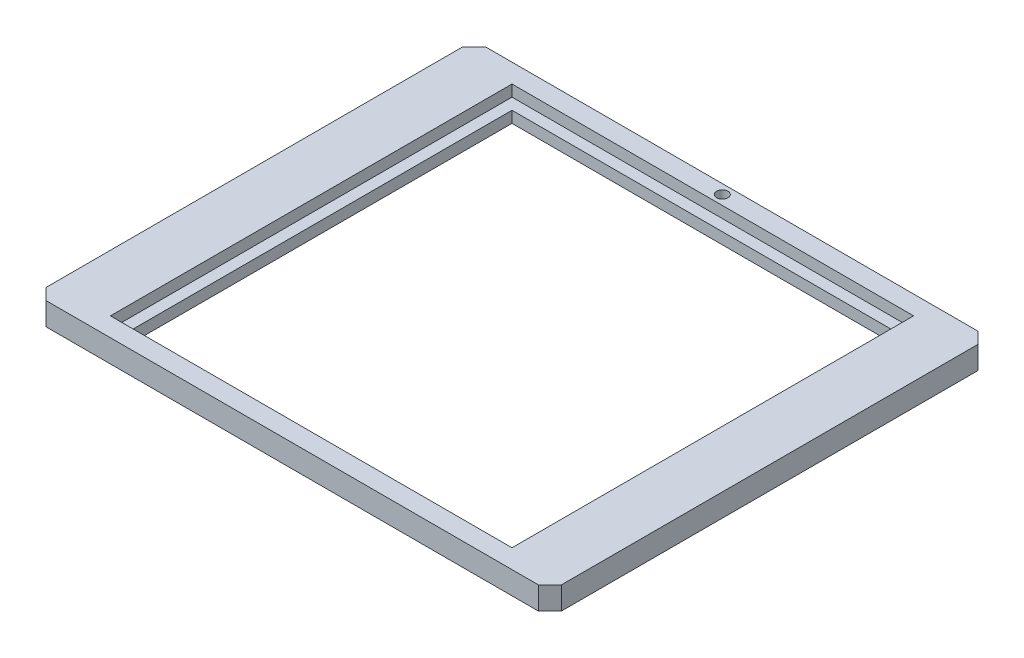
ISO-10303-21;
HEADER;
FILE_DESCRIPTION(('STEP AP214'),'2;1');
FILE_NAME('part.step','',(''),(''),'','','');
FILE_SCHEMA(('AUTOMOTIVE_DESIGN { 1 0 10303 214 1 1 1 1 }'));
ENDSEC;
DATA;
#1=APPLICATION_CONTEXT('core data for automotive mechanical design processes');
#2=APPLICATION_PROTOCOL_DEFINITION('international standard','automotive_design',2000,#1);
#3=PRODUCT_CONTEXT('',#1,'mechanical');
#4=PRODUCT('Part','Part','',(#3));
#5=PRODUCT_RELATED_PRODUCT_CATEGORY('part','',(#4));
#6=PRODUCT_DEFINITION_FORMATION('','',#4);
#7=PRODUCT_DEFINITION_CONTEXT('part definition',#1,'design');
#8=PRODUCT_DEFINITION('design','',#6,#7);
#9=PRODUCT_DEFINITION_SHAPE('','',#8);
#10=(LENGTH_UNIT() NAMED_UNIT(*) SI_UNIT(.MILLI.,.METRE.));
#11=(NAMED_UNIT(*) PLANE_ANGLE_UNIT() SI_UNIT($,.RADIAN.));
#12=(NAMED_UNIT(*) SI_UNIT($,.STERADIAN.) SOLID_ANGLE_UNIT());
#13=UNCERTAINTY_MEASURE_WITH_UNIT(LENGTH_MEASURE(1.E-05),#10,'distance_accuracy_value','');
#14=(GEOMETRIC_REPRESENTATION_CONTEXT(3) GLOBAL_UNCERTAINTY_ASSIGNED_CONTEXT((#13)) GLOBAL_UNIT_ASSIGNED_CONTEXT((#10,
#11,#12)) REPRESENTATION_CONTEXT('',''));
#15=CARTESIAN_POINT('',(0.,0.,0.));
#16=DIRECTION('',(0.,0.,1.));
#17=DIRECTION('',(1.,0.,0.));
#18=AXIS2_PLACEMENT_3D('',#15,#16,#17);
#19=CARTESIAN_POINT('',(68.,6.,58.));
#20=DIRECTION('',(-1.,0.,0.));
#21=DIRECTION('',(0.,0.,1.));
#22=AXIS2_PLACEMENT_3D('',#19,#20,#21);
#23=PLANE('',#22);
#24=DIRECTION('',(0.,0.,-1.));
#25=VECTOR('',#24,1.);
#26=CARTESIAN_POINT('',(68.,0.,58.));
#27=LINE('',#26,#25);
#28=CARTESIAN_POINT('',(68.,0.,55.));
#29=VERTEX_POINT('',#28);
#30=CARTESIAN_POINT('',(68.,0.,-55.));
#31=VERTEX_POINT('',#30);
#32=EDGE_CURVE('E218',#29,#31,#27,.T.);
#33=ORIENTED_EDGE('',*,*,#32,.T.);
#34=DIRECTION('',(0.,1.,0.));
#35=VECTOR('',#34,1.);
#36=CARTESIAN_POINT('',(68.,6.,-55.));
#37=LINE('',#36,#35);
#38=CARTESIAN_POINT('',(68.,6.,-55.));
#39=VERTEX_POINT('',#38);
#40=EDGE_CURVE('E273',#31,#39,#37,.T.);
#41=ORIENTED_EDGE('',*,*,#40,.T.);
#42=DIRECTION('',(0.,0.,-1.));
#43=VECTOR('',#42,1.);
#44=CARTESIAN_POINT('',(68.,6.,58.));
#45=LINE('',#44,#43);
#46=CARTESIAN_POINT('',(68.,6.,55.));
#47=VERTEX_POINT('',#46);
#48=EDGE_CURVE('E225',#47,#39,#45,.T.);
#49=ORIENTED_EDGE('',*,*,#48,.F.);
#50=DIRECTION('',(0.,-1.,0.));
#51=VECTOR('',#50,1.);
#52=CARTESIAN_POINT('',(68.,6.,55.));
#53=LINE('',#52,#51);
#54=EDGE_CURVE('E270',#47,#29,#53,.T.);
#55=ORIENTED_EDGE('',*,*,#54,.T.);
#56=EDGE_LOOP('',(#33,#41,#49,#55));
#57=FACE_BOUND('',#56,.T.);
#58=ADVANCED_FACE('F36',(#57),#23,.F.);
#59=CARTESIAN_POINT('',(-68.,6.,-58.));
#60=DIRECTION('',(0.,0.,1.));
#61=DIRECTION('',(1.,0.,0.));
#62=AXIS2_PLACEMENT_3D('',#59,#60,#61);
#63=PLANE('',#62);
#64=DIRECTION('',(-1.,0.,0.));
#65=VECTOR('',#64,1.);
#66=CARTESIAN_POINT('',(-68.,0.,-58.));
#67=LINE('',#66,#65);
#68=CARTESIAN_POINT('',(65.,0.,-58.));
#69=VERTEX_POINT('',#68);
#70=CARTESIAN_POINT('',(-65.,0.,-58.));
#71=VERTEX_POINT('',#70);
#72=EDGE_CURVE('E239',#69,#71,#67,.T.);
#73=ORIENTED_EDGE('',*,*,#72,.T.);
#74=DIRECTION('',(0.,1.,0.));
#75=VECTOR('',#74,1.);
#76=CARTESIAN_POINT('',(-65.,6.,-58.));
#77=LINE('',#76,#75);
#78=CARTESIAN_POINT('',(-65.,6.,-58.));
#79=VERTEX_POINT('',#78);
#80=EDGE_CURVE('E261',#71,#79,#77,.T.);
#81=ORIENTED_EDGE('',*,*,#80,.T.);
#82=DIRECTION('',(-1.,0.,0.));
#83=VECTOR('',#82,1.);
#84=CARTESIAN_POINT('',(-68.,6.,-58.));
#85=LINE('',#84,#83);
#86=CARTESIAN_POINT('',(65.,6.,-58.));
#87=VERTEX_POINT('',#86);
#88=EDGE_CURVE('E228',#87,#79,#85,.T.);
#89=ORIENTED_EDGE('',*,*,#88,.F.);
#90=DIRECTION('',(0.,-1.,0.));
#91=VECTOR('',#90,1.);
#92=CARTESIAN_POINT('',(65.,6.,-58.));
#93=LINE('',#92,#91);
#94=EDGE_CURVE('E258',#87,#69,#93,.T.);
#95=ORIENTED_EDGE('',*,*,#94,.T.);
#96=EDGE_LOOP('',(#73,#81,#89,#95));
#97=FACE_BOUND('',#96,.T.);
#98=ADVANCED_FACE('F299',(#97),#63,.F.);
#99=CARTESIAN_POINT('',(-68.,6.,58.));
#100=DIRECTION('',(1.,0.,0.));
#101=DIRECTION('',(0.,0.,-1.));
#102=AXIS2_PLACEMENT_3D('',#99,#100,#101);
#103=PLANE('',#102);
#104=DIRECTION('',(0.,0.,1.));
#105=VECTOR('',#104,1.);
#106=CARTESIAN_POINT('',(-68.,6.,58.));
#107=LINE('',#106,#105);
#108=CARTESIAN_POINT('',(-68.,6.,-55.));
#109=VERTEX_POINT('',#108);
#110=CARTESIAN_POINT('',(-68.,6.,55.));
#111=VERTEX_POINT('',#110);
#112=EDGE_CURVE('E232',#109,#111,#107,.T.);
#113=ORIENTED_EDGE('',*,*,#112,.F.);
#114=DIRECTION('',(0.,-1.,0.));
#115=VECTOR('',#114,1.);
#116=CARTESIAN_POINT('',(-68.,6.,-55.));
#117=LINE('',#116,#115);
#118=CARTESIAN_POINT('',(-68.,0.,-55.));
#119=VERTEX_POINT('',#118);
#120=EDGE_CURVE('E247',#109,#119,#117,.T.);
#121=ORIENTED_EDGE('',*,*,#120,.T.);
#122=DIRECTION('',(0.,0.,1.));
#123=VECTOR('',#122,1.);
#124=CARTESIAN_POINT('',(-68.,0.,58.));
#125=LINE('',#124,#123);
#126=CARTESIAN_POINT('',(-68.,0.,55.));
#127=VERTEX_POINT('',#126);
#128=EDGE_CURVE('E242',#119,#127,#125,.T.);
#129=ORIENTED_EDGE('',*,*,#128,.T.);
#130=DIRECTION('',(0.,1.,0.));
#131=VECTOR('',#130,1.);
#132=CARTESIAN_POINT('',(-68.,6.,55.));
#133=LINE('',#132,#131);
#134=EDGE_CURVE('E236',#127,#111,#133,.T.);
#135=ORIENTED_EDGE('',*,*,#134,.T.);
#136=EDGE_LOOP('',(#113,#121,#129,#135));
#137=FACE_BOUND('',#136,.T.);
#138=ADVANCED_FACE('F307',(#137),#103,.F.);
#139=CARTESIAN_POINT('',(-68.,6.,58.));
#140=DIRECTION('',(0.,0.,-1.));
#141=DIRECTION('',(-1.,0.,0.));
#142=AXIS2_PLACEMENT_3D('',#139,#140,#141);
#143=PLANE('',#142);
#144=DIRECTION('',(1.,0.,0.));
#145=VECTOR('',#144,1.);
#146=CARTESIAN_POINT('',(-68.,0.,58.));
#147=LINE('',#146,#145);
#148=CARTESIAN_POINT('',(-65.,0.,58.));
#149=VERTEX_POINT('',#148);
#150=CARTESIAN_POINT('',(65.,0.,58.));
#151=VERTEX_POINT('',#150);
#152=EDGE_CURVE('E229',#149,#151,#147,.T.);
#153=ORIENTED_EDGE('',*,*,#152,.T.);
#154=DIRECTION('',(0.,1.,0.));
#155=VECTOR('',#154,1.);
#156=CARTESIAN_POINT('',(65.,6.,58.));
#157=LINE('',#156,#155);
#158=CARTESIAN_POINT('',(65.,6.,58.));
#159=VERTEX_POINT('',#158);
#160=EDGE_CURVE('E11',#151,#159,#157,.T.);
#161=ORIENTED_EDGE('',*,*,#160,.T.);
#162=DIRECTION('',(1.,0.,0.));
#163=VECTOR('',#162,1.);
#164=CARTESIAN_POINT('',(-68.,6.,58.));
#165=LINE('',#164,#163);
#166=CARTESIAN_POINT('',(-65.,6.,58.));
#167=VERTEX_POINT('',#166);
#168=EDGE_CURVE('E234',#167,#159,#165,.T.);
#169=ORIENTED_EDGE('',*,*,#168,.F.);
#170=DIRECTION('',(0.,-1.,0.));
#171=VECTOR('',#170,1.);
#172=CARTESIAN_POINT('',(-65.,6.,58.));
#173=LINE('',#172,#171);
#174=EDGE_CURVE('E45',#167,#149,#173,.T.);
#175=ORIENTED_EDGE('',*,*,#174,.T.);
#176=EDGE_LOOP('',(#153,#161,#169,#175));
#177=FACE_BOUND('',#176,.T.);
#178=ADVANCED_FACE('F278',(#177),#143,.F.);
#179=CARTESIAN_POINT('',(0.,6.,0.));
#180=DIRECTION('',(0.,-1.,0.));
#181=DIRECTION('',(0.,0.,-1.));
#182=AXIS2_PLACEMENT_3D('',#179,#180,#181);
#183=PLANE('',#182);
#184=CARTESIAN_POINT('',(0.,6.,-55.5));
#185=DIRECTION('',(0.,1.,0.));
#186=DIRECTION('',(0.,0.,1.));
#187=AXIS2_PLACEMENT_3D('',#184,#185,#186);
#188=CIRCLE('',#187,1.5);
#189=CARTESIAN_POINT('',(0.,6.,-54.));
#190=VERTEX_POINT('',#189);
#191=EDGE_CURVE('E488',#190,#190,#188,.T.);
#192=ORIENTED_EDGE('',*,*,#191,.F.);
#193=EDGE_LOOP('',(#192));
#194=FACE_BOUND('',#193,.T.);
#195=DIRECTION('',(-1.,0.,0.));
#196=VECTOR('',#195,1.);
#197=CARTESIAN_POINT('',(-53.,6.,-53.));
#198=LINE('',#197,#196);
#199=CARTESIAN_POINT('',(53.,6.,-53.));
#200=VERTEX_POINT('',#199);
#201=CARTESIAN_POINT('',(-53.,6.,-53.));
#202=VERTEX_POINT('',#201);
#203=EDGE_CURVE('E208',#200,#202,#198,.T.);
#204=ORIENTED_EDGE('',*,*,#203,.F.);
#205=DIRECTION('',(0.,0.,-1.));
#206=VECTOR('',#205,1.);
#207=CARTESIAN_POINT('',(53.,6.,53.));
#208=LINE('',#207,#206);
#209=CARTESIAN_POINT('',(53.,6.,53.));
#210=VERTEX_POINT('',#209);
#211=EDGE_CURVE('E192',#210,#200,#208,.T.);
#212=ORIENTED_EDGE('',*,*,#211,.F.);
#213=DIRECTION('',(1.,0.,0.));
#214=VECTOR('',#213,1.);
#215=CARTESIAN_POINT('',(-53.,6.,53.));
#216=LINE('',#215,#214);
#217=CARTESIAN_POINT('',(-53.,6.,53.));
#218=VERTEX_POINT('',#217);
#219=EDGE_CURVE('E197',#218,#210,#216,.T.);
#220=ORIENTED_EDGE('',*,*,#219,.F.);
#221=DIRECTION('',(0.,0.,1.));
#222=VECTOR('',#221,1.);
#223=CARTESIAN_POINT('',(-53.,6.,53.));
#224=LINE('',#223,#222);
#225=EDGE_CURVE('E211',#202,#218,#224,.T.);
#226=ORIENTED_EDGE('',*,*,#225,.F.);
#227=EDGE_LOOP('',(#204,#212,#220,#226));
#228=FACE_BOUND('',#227,.T.);
#229=ORIENTED_EDGE('',*,*,#88,.T.);
#230=DIRECTION('',(0.707106781186548,0.,-0.707106781186548));
#231=VECTOR('',#230,1.);
#232=CARTESIAN_POINT('',(-68.,6.,-55.));
#233=LINE('',#232,#231);
#234=EDGE_CURVE('E268',#79,#109,#233,.F.);
#235=ORIENTED_EDGE('',*,*,#234,.T.);
#236=ORIENTED_EDGE('',*,*,#112,.T.);
#237=DIRECTION('',(-0.707106781186548,0.,-0.707106781186548));
#238=VECTOR('',#237,1.);
#239=CARTESIAN_POINT('',(-65.,6.,58.));
#240=LINE('',#239,#238);
#241=EDGE_CURVE('E57',#111,#167,#240,.F.);
#242=ORIENTED_EDGE('',*,*,#241,.T.);
#243=ORIENTED_EDGE('',*,*,#168,.T.);
#244=DIRECTION('',(-0.707106781186548,0.,0.707106781186548));
#245=VECTOR('',#244,1.);
#246=CARTESIAN_POINT('',(68.,6.,55.));
#247=LINE('',#246,#245);
#248=EDGE_CURVE('E264',#159,#47,#247,.F.);
#249=ORIENTED_EDGE('',*,*,#248,.T.);
#250=ORIENTED_EDGE('',*,*,#48,.T.);
#251=DIRECTION('',(0.707106781186548,0.,0.707106781186548));
#252=VECTOR('',#251,1.);
#253=CARTESIAN_POINT('',(65.,6.,-58.));
#254=LINE('',#253,#252);
#255=EDGE_CURVE('E266',#39,#87,#254,.F.);
#256=ORIENTED_EDGE('',*,*,#255,.T.);
#257=EDGE_LOOP('',(#229,#235,#236,#242,#243,#249,#250,#256));
#258=FACE_BOUND('',#257,.T.);
#259=ADVANCED_FACE('F292',(#194,#228,#258),#183,.F.);
#260=CARTESIAN_POINT('',(0.,0.,0.));
#261=DIRECTION('',(0.,-1.,0.));
#262=DIRECTION('',(0.,0.,-1.));
#263=AXIS2_PLACEMENT_3D('',#260,#261,#262);
#264=PLANE('',#263);
#265=CARTESIAN_POINT('',(0.,0.,-55.5));
#266=DIRECTION('',(0.,-1.,0.));
#267=DIRECTION('',(0.,0.,-1.));
#268=AXIS2_PLACEMENT_3D('',#265,#266,#267);
#269=CIRCLE('',#268,1.5);
#270=CARTESIAN_POINT('',(0.,0.,-57.));
#271=VERTEX_POINT('',#270);
#272=EDGE_CURVE('E40',#271,#271,#269,.T.);
#273=ORIENTED_EDGE('',*,*,#272,.F.);
#274=EDGE_LOOP('',(#273));
#275=FACE_BOUND('',#274,.T.);
#276=DIRECTION('',(0.,0.,1.));
#277=VECTOR('',#276,1.);
#278=CARTESIAN_POINT('',(50.,0.,0.));
#279=LINE('',#278,#277);
#280=CARTESIAN_POINT('',(50.,0.,-50.));
#281=VERTEX_POINT('',#280);
#282=CARTESIAN_POINT('',(50.,0.,50.));
#283=VERTEX_POINT('',#282);
#284=EDGE_CURVE('E190',#281,#283,#279,.T.);
#285=ORIENTED_EDGE('',*,*,#284,.F.);
#286=DIRECTION('',(1.,0.,0.));
#287=VECTOR('',#286,1.);
#288=CARTESIAN_POINT('',(0.,0.,-50.));
#289=LINE('',#288,#287);
#290=CARTESIAN_POINT('',(-50.,0.,-50.));
#291=VERTEX_POINT('',#290);
#292=EDGE_CURVE('E183',#291,#281,#289,.T.);
#293=ORIENTED_EDGE('',*,*,#292,.F.);
#294=DIRECTION('',(0.,0.,-1.));
#295=VECTOR('',#294,1.);
#296=CARTESIAN_POINT('',(-50.,0.,0.));
#297=LINE('',#296,#295);
#298=CARTESIAN_POINT('',(-50.,0.,50.));
#299=VERTEX_POINT('',#298);
#300=EDGE_CURVE('E158',#299,#291,#297,.T.);
#301=ORIENTED_EDGE('',*,*,#300,.F.);
#302=DIRECTION('',(-1.,0.,0.));
#303=VECTOR('',#302,1.);
#304=CARTESIAN_POINT('',(0.,0.,50.));
#305=LINE('',#304,#303);
#306=EDGE_CURVE('E188',#283,#299,#305,.T.);
#307=ORIENTED_EDGE('',*,*,#306,.F.);
#308=EDGE_LOOP('',(#285,#293,#301,#307));
#309=FACE_BOUND('',#308,.T.);
#310=ORIENTED_EDGE('',*,*,#128,.F.);
#311=DIRECTION('',(-0.707106781186548,0.,0.707106781186548));
#312=VECTOR('',#311,1.);
#313=CARTESIAN_POINT('',(-61.5,0.,-61.5));
#314=LINE('',#313,#312);
#315=EDGE_CURVE('E256',#119,#71,#314,.F.);
#316=ORIENTED_EDGE('',*,*,#315,.T.);
#317=ORIENTED_EDGE('',*,*,#72,.F.);
#318=DIRECTION('',(-0.707106781186548,0.,-0.707106781186548));
#319=VECTOR('',#318,1.);
#320=CARTESIAN_POINT('',(61.5,0.,-61.5));
#321=LINE('',#320,#319);
#322=EDGE_CURVE('E254',#69,#31,#321,.F.);
#323=ORIENTED_EDGE('',*,*,#322,.T.);
#324=ORIENTED_EDGE('',*,*,#32,.F.);
#325=DIRECTION('',(0.707106781186548,0.,-0.707106781186548));
#326=VECTOR('',#325,1.);
#327=CARTESIAN_POINT('',(61.5,0.,61.5));
#328=LINE('',#327,#326);
#329=EDGE_CURVE('E252',#29,#151,#328,.F.);
#330=ORIENTED_EDGE('',*,*,#329,.T.);
#331=ORIENTED_EDGE('',*,*,#152,.F.);
#332=DIRECTION('',(0.707106781186548,0.,0.707106781186548));
#333=VECTOR('',#332,1.);
#334=CARTESIAN_POINT('',(-61.5,0.,61.5));
#335=LINE('',#334,#333);
#336=EDGE_CURVE('E250',#149,#127,#335,.F.);
#337=ORIENTED_EDGE('',*,*,#336,.T.);
#338=EDGE_LOOP('',(#310,#316,#317,#323,#324,#330,#331,#337));
#339=FACE_BOUND('',#338,.T.);
#340=ADVANCED_FACE('F282',(#275,#309,#339),#264,.T.);
#341=CARTESIAN_POINT('',(53.,3.,53.));
#342=DIRECTION('',(1.,0.,0.));
#343=DIRECTION('',(0.,0.,-1.));
#344=AXIS2_PLACEMENT_3D('',#341,#342,#343);
#345=PLANE('',#344);
#346=ORIENTED_EDGE('',*,*,#211,.T.);
#347=DIRECTION('',(0.,1.,0.));
#348=VECTOR('',#347,1.);
#349=CARTESIAN_POINT('',(53.,3.,-53.));
#350=LINE('',#349,#348);
#351=CARTESIAN_POINT('',(53.,3.,-53.));
#352=VERTEX_POINT('',#351);
#353=EDGE_CURVE('E206',#352,#200,#350,.T.);
#354=ORIENTED_EDGE('',*,*,#353,.F.);
#355=DIRECTION('',(0.,0.,-1.));
#356=VECTOR('',#355,1.);
#357=CARTESIAN_POINT('',(53.,3.,53.));
#358=LINE('',#357,#356);
#359=CARTESIAN_POINT('',(53.,3.,53.));
#360=VERTEX_POINT('',#359);
#361=EDGE_CURVE('E193',#360,#352,#358,.T.);
#362=ORIENTED_EDGE('',*,*,#361,.F.);
#363=DIRECTION('',(0.,1.,0.));
#364=VECTOR('',#363,1.);
#365=CARTESIAN_POINT('',(53.,3.,53.));
#366=LINE('',#365,#364);
#367=EDGE_CURVE('E216',#360,#210,#366,.T.);
#368=ORIENTED_EDGE('',*,*,#367,.T.);
#369=EDGE_LOOP('',(#346,#354,#362,#368));
#370=FACE_BOUND('',#369,.T.);
#371=ADVANCED_FACE('F358',(#370),#345,.F.);
#372=CARTESIAN_POINT('',(-53.,3.,53.));
#373=DIRECTION('',(0.,0.,1.));
#374=DIRECTION('',(1.,0.,0.));
#375=AXIS2_PLACEMENT_3D('',#372,#373,#374);
#376=PLANE('',#375);
#377=ORIENTED_EDGE('',*,*,#219,.T.);
#378=ORIENTED_EDGE('',*,*,#367,.F.);
#379=DIRECTION('',(1.,0.,0.));
#380=VECTOR('',#379,1.);
#381=CARTESIAN_POINT('',(-53.,3.,53.));
#382=LINE('',#381,#380);
#383=CARTESIAN_POINT('',(-53.,3.,53.));
#384=VERTEX_POINT('',#383);
#385=EDGE_CURVE('E203',#384,#360,#382,.T.);
#386=ORIENTED_EDGE('',*,*,#385,.F.);
#387=DIRECTION('',(0.,1.,0.));
#388=VECTOR('',#387,1.);
#389=CARTESIAN_POINT('',(-53.,3.,53.));
#390=LINE('',#389,#388);
#391=EDGE_CURVE('E219',#384,#218,#390,.T.);
#392=ORIENTED_EDGE('',*,*,#391,.T.);
#393=EDGE_LOOP('',(#377,#378,#386,#392));
#394=FACE_BOUND('',#393,.T.);
#395=ADVANCED_FACE('F374',(#394),#376,.F.);
#396=CARTESIAN_POINT('',(-53.,3.,53.));
#397=DIRECTION('',(-1.,0.,0.));
#398=DIRECTION('',(0.,0.,1.));
#399=AXIS2_PLACEMENT_3D('',#396,#397,#398);
#400=PLANE('',#399);
#401=ORIENTED_EDGE('',*,*,#225,.T.);
#402=ORIENTED_EDGE('',*,*,#391,.F.);
#403=DIRECTION('',(0.,0.,1.));
#404=VECTOR('',#403,1.);
#405=CARTESIAN_POINT('',(-53.,3.,53.));
#406=LINE('',#405,#404);
#407=CARTESIAN_POINT('',(-53.,3.,-53.));
#408=VERTEX_POINT('',#407);
#409=EDGE_CURVE('E200',#408,#384,#406,.T.);
#410=ORIENTED_EDGE('',*,*,#409,.F.);
#411=DIRECTION('',(0.,1.,0.));
#412=VECTOR('',#411,1.);
#413=CARTESIAN_POINT('',(-53.,3.,-53.));
#414=LINE('',#413,#412);
#415=EDGE_CURVE('E221',#408,#202,#414,.T.);
#416=ORIENTED_EDGE('',*,*,#415,.T.);
#417=EDGE_LOOP('',(#401,#402,#410,#416));
#418=FACE_BOUND('',#417,.T.);
#419=ADVANCED_FACE('F381',(#418),#400,.F.);
#420=CARTESIAN_POINT('',(-53.,3.,-53.));
#421=DIRECTION('',(0.,0.,-1.));
#422=DIRECTION('',(-1.,0.,0.));
#423=AXIS2_PLACEMENT_3D('',#420,#421,#422);
#424=PLANE('',#423);
#425=ORIENTED_EDGE('',*,*,#203,.T.);
#426=ORIENTED_EDGE('',*,*,#415,.F.);
#427=DIRECTION('',(-1.,0.,0.));
#428=VECTOR('',#427,1.);
#429=CARTESIAN_POINT('',(-53.,3.,-53.));
#430=LINE('',#429,#428);
#431=EDGE_CURVE('E196',#352,#408,#430,.T.);
#432=ORIENTED_EDGE('',*,*,#431,.F.);
#433=ORIENTED_EDGE('',*,*,#353,.T.);
#434=EDGE_LOOP('',(#425,#426,#432,#433));
#435=FACE_BOUND('',#434,.T.);
#436=ADVANCED_FACE('F389',(#435),#424,.F.);
#437=CARTESIAN_POINT('',(0.,3.,0.));
#438=DIRECTION('',(0.,-1.,0.));
#439=DIRECTION('',(0.,0.,-1.));
#440=AXIS2_PLACEMENT_3D('',#437,#438,#439);
#441=PLANE('',#440);
#442=DIRECTION('',(-1.,0.,0.));
#443=VECTOR('',#442,1.);
#444=CARTESIAN_POINT('',(-50.,3.,-50.));
#445=LINE('',#444,#443);
#446=CARTESIAN_POINT('',(50.,3.,-50.));
#447=VERTEX_POINT('',#446);
#448=CARTESIAN_POINT('',(-50.,3.,-50.));
#449=VERTEX_POINT('',#448);
#450=EDGE_CURVE('E166',#447,#449,#445,.T.);
#451=ORIENTED_EDGE('',*,*,#450,.F.);
#452=DIRECTION('',(0.,0.,-1.));
#453=VECTOR('',#452,1.);
#454=CARTESIAN_POINT('',(50.,3.,50.));
#455=LINE('',#454,#453);
#456=CARTESIAN_POINT('',(50.,3.,50.));
#457=VERTEX_POINT('',#456);
#458=EDGE_CURVE('E171',#457,#447,#455,.T.);
#459=ORIENTED_EDGE('',*,*,#458,.F.);
#460=DIRECTION('',(1.,0.,0.));
#461=VECTOR('',#460,1.);
#462=CARTESIAN_POINT('',(-50.,3.,50.));
#463=LINE('',#462,#461);
#464=CARTESIAN_POINT('',(-50.,3.,50.));
#465=VERTEX_POINT('',#464);
#466=EDGE_CURVE('E176',#465,#457,#463,.T.);
#467=ORIENTED_EDGE('',*,*,#466,.F.);
#468=DIRECTION('',(0.,0.,1.));
#469=VECTOR('',#468,1.);
#470=CARTESIAN_POINT('',(-50.,3.,50.));
#471=LINE('',#470,#469);
#472=EDGE_CURVE('E155',#449,#465,#471,.T.);
#473=ORIENTED_EDGE('',*,*,#472,.F.);
#474=EDGE_LOOP('',(#451,#459,#467,#473));
#475=FACE_BOUND('',#474,.T.);
#476=ORIENTED_EDGE('',*,*,#361,.T.);
#477=ORIENTED_EDGE('',*,*,#431,.T.);
#478=ORIENTED_EDGE('',*,*,#409,.T.);
#479=ORIENTED_EDGE('',*,*,#385,.T.);
#480=EDGE_LOOP('',(#476,#477,#478,#479));
#481=FACE_BOUND('',#480,.T.);
#482=ADVANCED_FACE('F173',(#475,#481),#441,.F.);
#483=CARTESIAN_POINT('',(50.,-7.,50.));
#484=DIRECTION('',(1.,0.,0.));
#485=DIRECTION('',(0.,0.,-1.));
#486=AXIS2_PLACEMENT_3D('',#483,#484,#485);
#487=PLANE('',#486);
#488=ORIENTED_EDGE('',*,*,#284,.T.);
#489=DIRECTION('',(0.,1.,0.));
#490=VECTOR('',#489,1.);
#491=CARTESIAN_POINT('',(50.,-7.,50.));
#492=LINE('',#491,#490);
#493=EDGE_CURVE('E181',#283,#457,#492,.T.);
#494=ORIENTED_EDGE('',*,*,#493,.T.);
#495=ORIENTED_EDGE('',*,*,#458,.T.);
#496=DIRECTION('',(0.,1.,0.));
#497=VECTOR('',#496,1.);
#498=CARTESIAN_POINT('',(50.,-7.,-50.));
#499=LINE('',#498,#497);
#500=EDGE_CURVE('E162',#281,#447,#499,.T.);
#501=ORIENTED_EDGE('',*,*,#500,.F.);
#502=EDGE_LOOP('',(#488,#494,#495,#501));
#503=FACE_BOUND('',#502,.T.);
#504=ADVANCED_FACE('F404',(#503),#487,.F.);
#505=CARTESIAN_POINT('',(-50.,-7.,50.));
#506=DIRECTION('',(0.,0.,1.));
#507=DIRECTION('',(1.,0.,0.));
#508=AXIS2_PLACEMENT_3D('',#505,#506,#507);
#509=PLANE('',#508);
#510=ORIENTED_EDGE('',*,*,#306,.T.);
#511=DIRECTION('',(0.,1.,0.));
#512=VECTOR('',#511,1.);
#513=CARTESIAN_POINT('',(-50.,-7.,50.));
#514=LINE('',#513,#512);
#515=EDGE_CURVE('E161',#299,#465,#514,.T.);
#516=ORIENTED_EDGE('',*,*,#515,.T.);
#517=ORIENTED_EDGE('',*,*,#466,.T.);
#518=ORIENTED_EDGE('',*,*,#493,.F.);
#519=EDGE_LOOP('',(#510,#516,#517,#518));
#520=FACE_BOUND('',#519,.T.);
#521=ADVANCED_FACE('F411',(#520),#509,.F.);
#522=CARTESIAN_POINT('',(-50.,-7.,50.));
#523=DIRECTION('',(-1.,0.,0.));
#524=DIRECTION('',(0.,0.,1.));
#525=AXIS2_PLACEMENT_3D('',#522,#523,#524);
#526=PLANE('',#525);
#527=ORIENTED_EDGE('',*,*,#300,.T.);
#528=DIRECTION('',(0.,1.,0.));
#529=VECTOR('',#528,1.);
#530=CARTESIAN_POINT('',(-50.,-7.,-50.));
#531=LINE('',#530,#529);
#532=EDGE_CURVE('E150',#291,#449,#531,.T.);
#533=ORIENTED_EDGE('',*,*,#532,.T.);
#534=ORIENTED_EDGE('',*,*,#472,.T.);
#535=ORIENTED_EDGE('',*,*,#515,.F.);
#536=EDGE_LOOP('',(#527,#533,#534,#535));
#537=FACE_BOUND('',#536,.T.);
#538=ADVANCED_FACE('F152',(#537),#526,.F.);
#539=CARTESIAN_POINT('',(-50.,-7.,-50.));
#540=DIRECTION('',(0.,0.,-1.));
#541=DIRECTION('',(-1.,0.,0.));
#542=AXIS2_PLACEMENT_3D('',#539,#540,#541);
#543=PLANE('',#542);
#544=ORIENTED_EDGE('',*,*,#292,.T.);
#545=ORIENTED_EDGE('',*,*,#500,.T.);
#546=ORIENTED_EDGE('',*,*,#450,.T.);
#547=ORIENTED_EDGE('',*,*,#532,.F.);
#548=EDGE_LOOP('',(#544,#545,#546,#547));
#549=FACE_BOUND('',#548,.T.);
#550=ADVANCED_FACE('F167',(#549),#543,.F.);
#551=CARTESIAN_POINT('',(-68.,6.,-55.));
#552=DIRECTION('',(0.707106781186547,0.,0.707106781186547));
#553=DIRECTION('',(0.,-1.,0.));
#554=AXIS2_PLACEMENT_3D('',#551,#552,#553);
#555=PLANE('',#554);
#556=ORIENTED_EDGE('',*,*,#234,.F.);
#557=ORIENTED_EDGE('',*,*,#80,.F.);
#558=ORIENTED_EDGE('',*,*,#315,.F.);
#559=ORIENTED_EDGE('',*,*,#120,.F.);
#560=EDGE_LOOP('',(#556,#557,#558,#559));
#561=FACE_BOUND('',#560,.T.);
#562=ADVANCED_FACE('F304',(#561),#555,.F.);
#563=CARTESIAN_POINT('',(65.,6.,-58.));
#564=DIRECTION('',(-0.707106781186547,0.,0.707106781186547));
#565=DIRECTION('',(0.,-1.,0.));
#566=AXIS2_PLACEMENT_3D('',#563,#564,#565);
#567=PLANE('',#566);
#568=ORIENTED_EDGE('',*,*,#255,.F.);
#569=ORIENTED_EDGE('',*,*,#40,.F.);
#570=ORIENTED_EDGE('',*,*,#322,.F.);
#571=ORIENTED_EDGE('',*,*,#94,.F.);
#572=EDGE_LOOP('',(#568,#569,#570,#571));
#573=FACE_BOUND('',#572,.T.);
#574=ADVANCED_FACE('F296',(#573),#567,.F.);
#575=CARTESIAN_POINT('',(68.,6.,55.));
#576=DIRECTION('',(-0.707106781186547,0.,-0.707106781186547));
#577=DIRECTION('',(0.,-1.,0.));
#578=AXIS2_PLACEMENT_3D('',#575,#576,#577);
#579=PLANE('',#578);
#580=ORIENTED_EDGE('',*,*,#248,.F.);
#581=ORIENTED_EDGE('',*,*,#160,.F.);
#582=ORIENTED_EDGE('',*,*,#329,.F.);
#583=ORIENTED_EDGE('',*,*,#54,.F.);
#584=EDGE_LOOP('',(#580,#581,#582,#583));
#585=FACE_BOUND('',#584,.T.);
#586=ADVANCED_FACE('F287',(#585),#579,.F.);
#587=CARTESIAN_POINT('',(-65.,6.,58.));
#588=DIRECTION('',(0.707106781186547,0.,-0.707106781186547));
#589=DIRECTION('',(0.,-1.,0.));
#590=AXIS2_PLACEMENT_3D('',#587,#588,#589);
#591=PLANE('',#590);
#592=ORIENTED_EDGE('',*,*,#241,.F.);
#593=ORIENTED_EDGE('',*,*,#134,.F.);
#594=ORIENTED_EDGE('',*,*,#336,.F.);
#595=ORIENTED_EDGE('',*,*,#174,.F.);
#596=EDGE_LOOP('',(#592,#593,#594,#595));
#597=FACE_BOUND('',#596,.T.);
#598=ADVANCED_FACE('F38',(#597),#591,.F.);
#599=CARTESIAN_POINT('',(0.,-4.,-55.5));
#600=DIRECTION('',(0.,1.,0.));
#601=DIRECTION('',(0.,0.,1.));
#602=AXIS2_PLACEMENT_3D('',#599,#600,#601);
#603=CYLINDRICAL_SURFACE('',#602,1.5);
#604=ORIENTED_EDGE('',*,*,#272,.T.);
#605=EDGE_LOOP('',(#604));
#606=FACE_BOUND('',#605,.T.);
#607=ORIENTED_EDGE('',*,*,#191,.T.);
#608=EDGE_LOOP('',(#607));
#609=FACE_BOUND('',#608,.T.);
#610=ADVANCED_FACE('F310',(#606,#609),#603,.F.);
#611=CLOSED_SHELL('',(#58,#98,#138,#178,#259,#340,#371,#395,#419,#436,#482,#504,#521,#538,#550,
#562,#574,#586,#598,#610));
#612=MANIFOLD_SOLID_BREP('B2',#611);
#613=ADVANCED_BREP_SHAPE_REPRESENTATION('',(#18,#612),#14);
#614=SHAPE_DEFINITION_REPRESENTATION(#9,#613);
ENDSEC;
END-ISO-10303-21;
